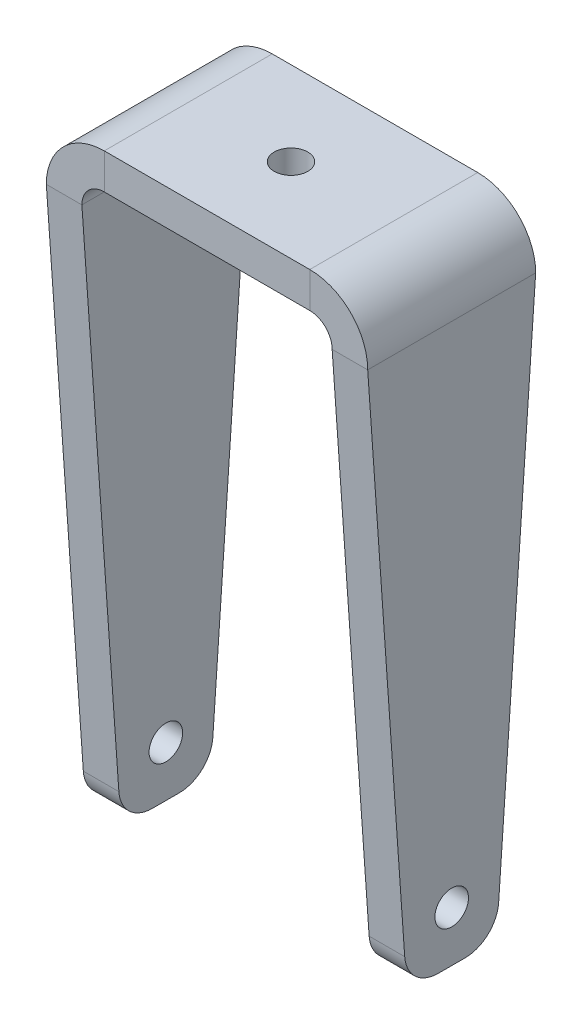
ISO-10303-21;
HEADER;
FILE_DESCRIPTION(('STEP AP214'),'2;1');
FILE_NAME('part.step','',(''),(''),'','','');
FILE_SCHEMA(('AUTOMOTIVE_DESIGN { 1 0 10303 214 1 1 1 1 }'));
ENDSEC;
DATA;
#1=APPLICATION_CONTEXT('core data for automotive mechanical design processes');
#2=APPLICATION_PROTOCOL_DEFINITION('international standard','automotive_design',2000,#1);
#3=PRODUCT_CONTEXT('',#1,'mechanical');
#4=PRODUCT('Part','Part','',(#3));
#5=PRODUCT_RELATED_PRODUCT_CATEGORY('part','',(#4));
#6=PRODUCT_DEFINITION_FORMATION('','',#4);
#7=PRODUCT_DEFINITION_CONTEXT('part definition',#1,'design');
#8=PRODUCT_DEFINITION('design','',#6,#7);
#9=PRODUCT_DEFINITION_SHAPE('','',#8);
#10=(LENGTH_UNIT() NAMED_UNIT(*) SI_UNIT(.MILLI.,.METRE.));
#11=(NAMED_UNIT(*) PLANE_ANGLE_UNIT() SI_UNIT($,.RADIAN.));
#12=(NAMED_UNIT(*) SI_UNIT($,.STERADIAN.) SOLID_ANGLE_UNIT());
#13=UNCERTAINTY_MEASURE_WITH_UNIT(LENGTH_MEASURE(1.E-05),#10,'distance_accuracy_value','');
#14=(GEOMETRIC_REPRESENTATION_CONTEXT(3) GLOBAL_UNCERTAINTY_ASSIGNED_CONTEXT((#13)) GLOBAL_UNIT_ASSIGNED_CONTEXT((#10,
#11,#12)) REPRESENTATION_CONTEXT('',''));
#15=CARTESIAN_POINT('',(0.,0.,0.));
#16=DIRECTION('',(0.,0.,1.));
#17=DIRECTION('',(1.,0.,0.));
#18=AXIS2_PLACEMENT_3D('',#15,#16,#17);
#19=CARTESIAN_POINT('',(0.,-3.175,0.));
#20=DIRECTION('',(0.,-1.,0.));
#21=DIRECTION('',(0.,0.,-1.));
#22=AXIS2_PLACEMENT_3D('',#19,#20,#21);
#23=PLANE('',#22);
#24=CARTESIAN_POINT('',(0.,-3.175,-7.50000000000008));
#25=DIRECTION('',(0.,-1.,0.));
#26=DIRECTION('',(0.,0.,-1.));
#27=AXIS2_PLACEMENT_3D('',#24,#25,#26);
#28=CIRCLE('',#27,1.50000000000001);
#29=CARTESIAN_POINT('',(0.,-3.175,-9.00000000000008));
#30=VERTEX_POINT('',#29);
#31=EDGE_CURVE('E233',#30,#30,#28,.T.);
#32=ORIENTED_EDGE('',*,*,#31,.F.);
#33=EDGE_LOOP('',(#32));
#34=FACE_BOUND('',#33,.T.);
#35=DIRECTION('',(1.,0.,0.));
#36=VECTOR('',#35,1.);
#37=CARTESIAN_POINT('',(-14.3500000000016,-3.175,0.));
#38=LINE('',#37,#36);
#39=CARTESIAN_POINT('',(-9.17500000000162,-3.175,0.));
#40=VERTEX_POINT('',#39);
#41=CARTESIAN_POINT('',(9.17500000000162,-3.175,0.));
#42=VERTEX_POINT('',#41);
#43=EDGE_CURVE('E284',#40,#42,#38,.T.);
#44=ORIENTED_EDGE('',*,*,#43,.F.);
#45=DIRECTION('',(0.,0.,-1.));
#46=VECTOR('',#45,1.);
#47=CARTESIAN_POINT('',(-9.17500000000162,-3.175,-15.));
#48=LINE('',#47,#46);
#49=CARTESIAN_POINT('',(-9.17500000000162,-3.175,-15.));
#50=VERTEX_POINT('',#49);
#51=EDGE_CURVE('E240',#50,#40,#48,.F.);
#52=ORIENTED_EDGE('',*,*,#51,.F.);
#53=DIRECTION('',(-1.,0.,0.));
#54=VECTOR('',#53,1.);
#55=CARTESIAN_POINT('',(-14.3500000000016,-3.175,-15.));
#56=LINE('',#55,#54);
#57=CARTESIAN_POINT('',(9.17500000000162,-3.175,-15.));
#58=VERTEX_POINT('',#57);
#59=EDGE_CURVE('E281',#58,#50,#56,.T.);
#60=ORIENTED_EDGE('',*,*,#59,.F.);
#61=DIRECTION('',(0.,0.,1.));
#62=VECTOR('',#61,1.);
#63=CARTESIAN_POINT('',(9.17500000000162,-3.175,0.));
#64=LINE('',#63,#62);
#65=EDGE_CURVE('E269',#42,#58,#64,.F.);
#66=ORIENTED_EDGE('',*,*,#65,.F.);
#67=EDGE_LOOP('',(#44,#52,#60,#66));
#68=FACE_BOUND('',#67,.T.);
#69=ADVANCED_FACE('F79',(#34,#68),#23,.T.);
#70=CARTESIAN_POINT('',(0.,0.,0.));
#71=DIRECTION('',(0.,-1.,0.));
#72=DIRECTION('',(0.,0.,-1.));
#73=AXIS2_PLACEMENT_3D('',#70,#71,#72);
#74=PLANE('',#73);
#75=CARTESIAN_POINT('',(0.,0.,-7.50000000000008));
#76=DIRECTION('',(0.,1.,0.));
#77=DIRECTION('',(0.,0.,1.));
#78=AXIS2_PLACEMENT_3D('',#75,#76,#77);
#79=CIRCLE('',#78,1.50000000000001);
#80=CARTESIAN_POINT('',(0.,0.,-6.00000000000007));
#81=VERTEX_POINT('',#80);
#82=EDGE_CURVE('E331',#81,#81,#79,.T.);
#83=ORIENTED_EDGE('',*,*,#82,.F.);
#84=EDGE_LOOP('',(#83));
#85=FACE_BOUND('',#84,.T.);
#86=DIRECTION('',(0.,0.,-1.));
#87=VECTOR('',#86,1.);
#88=CARTESIAN_POINT('',(-9.17500000000162,0.,-15.));
#89=LINE('',#88,#87);
#90=CARTESIAN_POINT('',(-9.17500000000162,0.,-15.));
#91=VERTEX_POINT('',#90);
#92=CARTESIAN_POINT('',(-9.17500000000162,0.,0.));
#93=VERTEX_POINT('',#92);
#94=EDGE_CURVE('E209',#91,#93,#89,.F.);
#95=ORIENTED_EDGE('',*,*,#94,.T.);
#96=DIRECTION('',(1.,0.,0.));
#97=VECTOR('',#96,1.);
#98=CARTESIAN_POINT('',(-14.3500000000016,0.,0.));
#99=LINE('',#98,#97);
#100=CARTESIAN_POINT('',(9.17500000000162,0.,0.));
#101=VERTEX_POINT('',#100);
#102=EDGE_CURVE('E285',#93,#101,#99,.T.);
#103=ORIENTED_EDGE('',*,*,#102,.T.);
#104=DIRECTION('',(0.,0.,1.));
#105=VECTOR('',#104,1.);
#106=CARTESIAN_POINT('',(9.17500000000162,0.,0.));
#107=LINE('',#106,#105);
#108=CARTESIAN_POINT('',(9.17500000000162,0.,-15.));
#109=VERTEX_POINT('',#108);
#110=EDGE_CURVE('E262',#101,#109,#107,.F.);
#111=ORIENTED_EDGE('',*,*,#110,.T.);
#112=DIRECTION('',(-1.,0.,0.));
#113=VECTOR('',#112,1.);
#114=CARTESIAN_POINT('',(-14.3500000000016,0.,-15.));
#115=LINE('',#114,#113);
#116=EDGE_CURVE('E277',#109,#91,#115,.T.);
#117=ORIENTED_EDGE('',*,*,#116,.T.);
#118=EDGE_LOOP('',(#95,#103,#111,#117));
#119=FACE_BOUND('',#118,.T.);
#120=ADVANCED_FACE('F421',(#85,#119),#74,.F.);
#121=CARTESIAN_POINT('',(-14.3500000000016,-3.175,-15.));
#122=DIRECTION('',(0.,0.,-1.));
#123=DIRECTION('',(-1.,0.,0.));
#124=AXIS2_PLACEMENT_3D('',#121,#122,#123);
#125=PLANE('',#124);
#126=ORIENTED_EDGE('',*,*,#59,.T.);
#127=DIRECTION('',(0.,1.,0.));
#128=VECTOR('',#127,1.);
#129=CARTESIAN_POINT('',(-9.17500000000162,-3.175,-15.));
#130=LINE('',#129,#128);
#131=EDGE_CURVE('E236',#50,#91,#130,.T.);
#132=ORIENTED_EDGE('',*,*,#131,.T.);
#133=ORIENTED_EDGE('',*,*,#116,.F.);
#134=DIRECTION('',(0.,1.,0.));
#135=VECTOR('',#134,1.);
#136=CARTESIAN_POINT('',(9.17500000000162,-3.175,-15.));
#137=LINE('',#136,#135);
#138=EDGE_CURVE('E274',#58,#109,#137,.T.);
#139=ORIENTED_EDGE('',*,*,#138,.F.);
#140=EDGE_LOOP('',(#126,#132,#133,#139));
#141=FACE_BOUND('',#140,.T.);
#142=ADVANCED_FACE('F406',(#141),#125,.T.);
#143=CARTESIAN_POINT('',(-14.3500000000016,-3.175,0.));
#144=DIRECTION('',(0.,0.,1.));
#145=DIRECTION('',(1.,0.,0.));
#146=AXIS2_PLACEMENT_3D('',#143,#144,#145);
#147=PLANE('',#146);
#148=DIRECTION('',(0.,1.,0.));
#149=VECTOR('',#148,1.);
#150=CARTESIAN_POINT('',(-9.17500000000162,-3.175,0.));
#151=LINE('',#150,#149);
#152=EDGE_CURVE('E244',#40,#93,#151,.T.);
#153=ORIENTED_EDGE('',*,*,#152,.F.);
#154=ORIENTED_EDGE('',*,*,#43,.T.);
#155=DIRECTION('',(0.,1.,0.));
#156=VECTOR('',#155,1.);
#157=CARTESIAN_POINT('',(9.17500000000162,-3.175,0.));
#158=LINE('',#157,#156);
#159=EDGE_CURVE('E278',#42,#101,#158,.T.);
#160=ORIENTED_EDGE('',*,*,#159,.T.);
#161=ORIENTED_EDGE('',*,*,#102,.F.);
#162=EDGE_LOOP('',(#153,#154,#160,#161));
#163=FACE_BOUND('',#162,.T.);
#164=ADVANCED_FACE('F419',(#163),#147,.T.);
#165=CARTESIAN_POINT('',(9.17500000000162,-5.175,-15.));
#166=DIRECTION('',(0.,0.,-1.));
#167=DIRECTION('',(-1.,0.,0.));
#168=AXIS2_PLACEMENT_3D('',#165,#166,#167);
#169=PLANE('',#168);
#170=DIRECTION('',(1.,0.,0.));
#171=VECTOR('',#170,1.);
#172=CARTESIAN_POINT('',(14.3500000000016,-5.17499999999998,-15.));
#173=LINE('',#172,#171);
#174=CARTESIAN_POINT('',(11.1750000000016,-5.17499999999999,-15.));
#175=VERTEX_POINT('',#174);
#176=CARTESIAN_POINT('',(14.3500000000016,-5.17499999999998,-15.));
#177=VERTEX_POINT('',#176);
#178=EDGE_CURVE('E247',#175,#177,#173,.T.);
#179=ORIENTED_EDGE('',*,*,#178,.F.);
#180=CARTESIAN_POINT('',(9.17500000000162,-5.175,-15.));
#181=DIRECTION('',(0.,0.,1.));
#182=DIRECTION('',(1.,0.,0.));
#183=AXIS2_PLACEMENT_3D('',#180,#181,#182);
#184=CIRCLE('',#183,2.);
#185=EDGE_CURVE('E266',#58,#175,#184,.F.);
#186=ORIENTED_EDGE('',*,*,#185,.F.);
#187=ORIENTED_EDGE('',*,*,#138,.T.);
#188=CARTESIAN_POINT('',(9.17500000000162,-5.175,-15.));
#189=DIRECTION('',(0.,0.,1.));
#190=DIRECTION('',(1.,0.,0.));
#191=AXIS2_PLACEMENT_3D('',#188,#189,#190);
#192=CIRCLE('',#191,5.175);
#193=EDGE_CURVE('E264',#109,#177,#192,.F.);
#194=ORIENTED_EDGE('',*,*,#193,.T.);
#195=EDGE_LOOP('',(#179,#186,#187,#194));
#196=FACE_BOUND('',#195,.T.);
#197=ADVANCED_FACE('F401',(#196),#169,.T.);
#198=CARTESIAN_POINT('',(9.17500000000162,-5.175,0.));
#199=DIRECTION('',(0.,0.,-1.));
#200=DIRECTION('',(-1.,0.,0.));
#201=AXIS2_PLACEMENT_3D('',#198,#199,#200);
#202=PLANE('',#201);
#203=CARTESIAN_POINT('',(9.17500000000162,-5.175,0.));
#204=DIRECTION('',(0.,0.,1.));
#205=DIRECTION('',(1.,0.,0.));
#206=AXIS2_PLACEMENT_3D('',#203,#204,#205);
#207=CIRCLE('',#206,2.);
#208=CARTESIAN_POINT('',(11.1750000000016,-5.17499999999999,0.));
#209=VERTEX_POINT('',#208);
#210=EDGE_CURVE('E253',#209,#42,#207,.T.);
#211=ORIENTED_EDGE('',*,*,#210,.F.);
#212=DIRECTION('',(1.,0.,0.));
#213=VECTOR('',#212,1.);
#214=CARTESIAN_POINT('',(11.1750000000016,-5.17499999999999,0.));
#215=LINE('',#214,#213);
#216=CARTESIAN_POINT('',(14.3500000000016,-5.17499999999998,0.));
#217=VERTEX_POINT('',#216);
#218=EDGE_CURVE('E261',#209,#217,#215,.T.);
#219=ORIENTED_EDGE('',*,*,#218,.T.);
#220=CARTESIAN_POINT('',(9.17500000000162,-5.175,0.));
#221=DIRECTION('',(0.,0.,1.));
#222=DIRECTION('',(1.,0.,0.));
#223=AXIS2_PLACEMENT_3D('',#220,#221,#222);
#224=CIRCLE('',#223,5.175);
#225=EDGE_CURVE('E265',#217,#101,#224,.T.);
#226=ORIENTED_EDGE('',*,*,#225,.T.);
#227=ORIENTED_EDGE('',*,*,#159,.F.);
#228=EDGE_LOOP('',(#211,#219,#226,#227));
#229=FACE_BOUND('',#228,.T.);
#230=ADVANCED_FACE('F416',(#229),#202,.F.);
#231=CARTESIAN_POINT('',(9.17500000000162,-5.175,0.));
#232=DIRECTION('',(0.,0.,1.));
#233=DIRECTION('',(1.,0.,0.));
#234=AXIS2_PLACEMENT_3D('',#231,#232,#233);
#235=CYLINDRICAL_SURFACE('',#234,5.175);
#236=ORIENTED_EDGE('',*,*,#110,.F.);
#237=ORIENTED_EDGE('',*,*,#225,.F.);
#238=DIRECTION('',(0.,0.,1.));
#239=VECTOR('',#238,1.);
#240=CARTESIAN_POINT('',(14.3500000000016,-5.17499999999998,0.));
#241=LINE('',#240,#239);
#242=EDGE_CURVE('E257',#177,#217,#241,.T.);
#243=ORIENTED_EDGE('',*,*,#242,.F.);
#244=ORIENTED_EDGE('',*,*,#193,.F.);
#245=EDGE_LOOP('',(#236,#237,#243,#244));
#246=FACE_BOUND('',#245,.T.);
#247=ADVANCED_FACE('F398',(#246),#235,.T.);
#248=CARTESIAN_POINT('',(9.17500000000162,-5.175,0.));
#249=DIRECTION('',(0.,0.,1.));
#250=DIRECTION('',(1.,0.,0.));
#251=AXIS2_PLACEMENT_3D('',#248,#249,#250);
#252=CYLINDRICAL_SURFACE('',#251,2.);
#253=ORIENTED_EDGE('',*,*,#65,.T.);
#254=ORIENTED_EDGE('',*,*,#185,.T.);
#255=DIRECTION('',(0.,0.,-1.));
#256=VECTOR('',#255,1.);
#257=CARTESIAN_POINT('',(11.1750000000016,-5.17499999999999,-15.0000000000001));
#258=LINE('',#257,#256);
#259=EDGE_CURVE('E258',#175,#209,#258,.F.);
#260=ORIENTED_EDGE('',*,*,#259,.T.);
#261=ORIENTED_EDGE('',*,*,#210,.T.);
#262=EDGE_LOOP('',(#253,#254,#260,#261));
#263=FACE_BOUND('',#262,.T.);
#264=ADVANCED_FACE('F412',(#263),#252,.F.);
#265=CARTESIAN_POINT('',(14.3500000000016,0.,0.));
#266=DIRECTION('',(1.,0.,0.));
#267=DIRECTION('',(0.,1.,0.));
#268=AXIS2_PLACEMENT_3D('',#265,#266,#267);
#269=PLANE('',#268);
#270=CARTESIAN_POINT('',(14.3500000000018,-50.5,-7.5));
#271=DIRECTION('',(1.,0.,0.));
#272=DIRECTION('',(0.,1.,0.));
#273=AXIS2_PLACEMENT_3D('',#270,#271,#272);
#274=CIRCLE('',#273,1.5);
#275=CARTESIAN_POINT('',(14.3500000000018,-49.,-7.5));
#276=VERTEX_POINT('',#275);
#277=EDGE_CURVE('E362',#276,#276,#274,.T.);
#278=ORIENTED_EDGE('',*,*,#277,.F.);
#279=EDGE_LOOP('',(#278));
#280=FACE_BOUND('',#279,.T.);
#281=DIRECTION('',(0.,0.997541853068174,0.0700731858653007));
#282=VECTOR('',#281,1.);
#283=CARTESIAN_POINT('',(14.3500000000016,-0.0254105508775338,0.361737342136047));
#284=LINE('',#283,#282);
#285=CARTESIAN_POINT('',(14.3500000000018,-52.2102195575959,-3.30402947218436));
#286=VERTEX_POINT('',#285);
#287=EDGE_CURVE('E314',#286,#217,#284,.T.);
#288=ORIENTED_EDGE('',*,*,#287,.F.);
#289=CARTESIAN_POINT('',(14.3500000000018,-52.,-6.29665503138888));
#290=DIRECTION('',(1.,0.,0.));
#291=DIRECTION('',(0.,1.,0.));
#292=AXIS2_PLACEMENT_3D('',#289,#290,#291);
#293=CIRCLE('',#292,3.);
#294=CARTESIAN_POINT('',(14.3500000000018,-55.,-6.29665503138888));
#295=VERTEX_POINT('',#294);
#296=EDGE_CURVE('E378',#286,#295,#293,.T.);
#297=ORIENTED_EDGE('',*,*,#296,.T.);
#298=DIRECTION('',(0.,0.,1.));
#299=VECTOR('',#298,1.);
#300=CARTESIAN_POINT('',(14.3500000000018,-55.,0.));
#301=LINE('',#300,#299);
#302=CARTESIAN_POINT('',(14.3500000000018,-55.,-8.70334496861112));
#303=VERTEX_POINT('',#302);
#304=EDGE_CURVE('E250',#303,#295,#301,.T.);
#305=ORIENTED_EDGE('',*,*,#304,.F.);
#306=CARTESIAN_POINT('',(14.3500000000018,-52.,-8.70334496861112));
#307=DIRECTION('',(1.,0.,0.));
#308=DIRECTION('',(0.,1.,0.));
#309=AXIS2_PLACEMENT_3D('',#306,#307,#308);
#310=CIRCLE('',#309,3.);
#311=CARTESIAN_POINT('',(14.3500000000018,-52.2102195575959,-11.6959705278156));
#312=VERTEX_POINT('',#311);
#313=EDGE_CURVE('E379',#303,#312,#310,.T.);
#314=ORIENTED_EDGE('',*,*,#313,.T.);
#315=DIRECTION('',(0.,-0.997541853068174,0.0700731858653007));
#316=VECTOR('',#315,1.);
#317=CARTESIAN_POINT('',(14.3500000000016,-1.07392458605447,-15.2880835714764));
#318=LINE('',#317,#316);
#319=EDGE_CURVE('E328',#177,#312,#318,.T.);
#320=ORIENTED_EDGE('',*,*,#319,.F.);
#321=ORIENTED_EDGE('',*,*,#242,.T.);
#322=EDGE_LOOP('',(#288,#297,#305,#314,#320,#321));
#323=FACE_BOUND('',#322,.T.);
#324=ADVANCED_FACE('F393',(#280,#323),#269,.T.);
#325=CARTESIAN_POINT('',(11.1750000000016,0.,0.));
#326=DIRECTION('',(1.,0.,0.));
#327=DIRECTION('',(0.,1.,0.));
#328=AXIS2_PLACEMENT_3D('',#325,#326,#327);
#329=PLANE('',#328);
#330=CARTESIAN_POINT('',(11.1750000000018,-50.5,-7.5));
#331=DIRECTION('',(1.,0.,0.));
#332=DIRECTION('',(0.,1.,0.));
#333=AXIS2_PLACEMENT_3D('',#330,#331,#332);
#334=CIRCLE('',#333,1.5);
#335=CARTESIAN_POINT('',(11.1750000000018,-49.,-7.5));
#336=VERTEX_POINT('',#335);
#337=EDGE_CURVE('E312',#336,#336,#334,.T.);
#338=ORIENTED_EDGE('',*,*,#337,.T.);
#339=EDGE_LOOP('',(#338));
#340=FACE_BOUND('',#339,.T.);
#341=DIRECTION('',(0.,0.,-1.));
#342=VECTOR('',#341,1.);
#343=CARTESIAN_POINT('',(11.1750000000018,-55.,0.));
#344=LINE('',#343,#342);
#345=CARTESIAN_POINT('',(11.1750000000018,-55.,-8.70334496861112));
#346=VERTEX_POINT('',#345);
#347=CARTESIAN_POINT('',(11.1750000000018,-55.,-6.29665503138888));
#348=VERTEX_POINT('',#347);
#349=EDGE_CURVE('E254',#346,#348,#344,.F.);
#350=ORIENTED_EDGE('',*,*,#349,.T.);
#351=CARTESIAN_POINT('',(11.1750000000018,-52.,-6.29665503138888));
#352=DIRECTION('',(1.,0.,0.));
#353=DIRECTION('',(0.,1.,0.));
#354=AXIS2_PLACEMENT_3D('',#351,#352,#353);
#355=CIRCLE('',#354,3.);
#356=CARTESIAN_POINT('',(11.1750000000018,-52.2102195575959,-3.30402947218436));
#357=VERTEX_POINT('',#356);
#358=EDGE_CURVE('E367',#348,#357,#355,.F.);
#359=ORIENTED_EDGE('',*,*,#358,.T.);
#360=DIRECTION('',(0.,0.997541853068174,0.0700731858653007));
#361=VECTOR('',#360,1.);
#362=CARTESIAN_POINT('',(11.1750000000016,-0.0254105508775449,0.361737342136047));
#363=LINE('',#362,#361);
#364=EDGE_CURVE('E318',#357,#209,#363,.T.);
#365=ORIENTED_EDGE('',*,*,#364,.T.);
#366=ORIENTED_EDGE('',*,*,#259,.F.);
#367=DIRECTION('',(0.,-0.997541853068174,0.0700731858653007));
#368=VECTOR('',#367,1.);
#369=CARTESIAN_POINT('',(11.1750000000016,-1.07392458605449,-15.2880835714764));
#370=LINE('',#369,#368);
#371=CARTESIAN_POINT('',(11.1750000000018,-52.2102195575959,-11.6959705278156));
#372=VERTEX_POINT('',#371);
#373=EDGE_CURVE('E325',#175,#372,#370,.T.);
#374=ORIENTED_EDGE('',*,*,#373,.T.);
#375=CARTESIAN_POINT('',(11.1750000000018,-52.,-8.70334496861112));
#376=DIRECTION('',(1.,0.,0.));
#377=DIRECTION('',(0.,1.,0.));
#378=AXIS2_PLACEMENT_3D('',#375,#376,#377);
#379=CIRCLE('',#378,3.);
#380=EDGE_CURVE('E371',#372,#346,#379,.F.);
#381=ORIENTED_EDGE('',*,*,#380,.T.);
#382=EDGE_LOOP('',(#350,#359,#365,#366,#374,#381));
#383=FACE_BOUND('',#382,.T.);
#384=ADVANCED_FACE('F570',(#340,#383),#329,.F.);
#385=CARTESIAN_POINT('',(14.3500000000018,-55.,0.));
#386=DIRECTION('',(0.,-1.,0.));
#387=DIRECTION('',(1.,0.,0.));
#388=AXIS2_PLACEMENT_3D('',#385,#386,#387);
#389=PLANE('',#388);
#390=ORIENTED_EDGE('',*,*,#304,.T.);
#391=DIRECTION('',(1.,0.,0.));
#392=VECTOR('',#391,1.);
#393=CARTESIAN_POINT('',(11.1750000000018,-55.,-6.29665503138888));
#394=LINE('',#393,#392);
#395=EDGE_CURVE('E373',#295,#348,#394,.F.);
#396=ORIENTED_EDGE('',*,*,#395,.T.);
#397=ORIENTED_EDGE('',*,*,#349,.F.);
#398=DIRECTION('',(1.,0.,0.));
#399=VECTOR('',#398,1.);
#400=CARTESIAN_POINT('',(14.3500000000018,-55.,-8.70334496861112));
#401=LINE('',#400,#399);
#402=EDGE_CURVE('E375',#346,#303,#401,.T.);
#403=ORIENTED_EDGE('',*,*,#402,.T.);
#404=EDGE_LOOP('',(#390,#396,#397,#403));
#405=FACE_BOUND('',#404,.T.);
#406=ADVANCED_FACE('F564',(#405),#389,.T.);
#407=CARTESIAN_POINT('',(-9.17500000000162,-5.175,0.));
#408=DIRECTION('',(0.,0.,1.));
#409=DIRECTION('',(1.,0.,0.));
#410=AXIS2_PLACEMENT_3D('',#407,#408,#409);
#411=PLANE('',#410);
#412=DIRECTION('',(-1.,0.,0.));
#413=VECTOR('',#412,1.);
#414=CARTESIAN_POINT('',(-14.3500000000016,-5.17499999999998,0.));
#415=LINE('',#414,#413);
#416=CARTESIAN_POINT('',(-11.1750000000016,-5.17500000000007,0.));
#417=VERTEX_POINT('',#416);
#418=CARTESIAN_POINT('',(-14.350000000002,-5.17500000000008,0.));
#419=VERTEX_POINT('',#418);
#420=EDGE_CURVE('E231',#417,#419,#415,.T.);
#421=ORIENTED_EDGE('',*,*,#420,.F.);
#422=CARTESIAN_POINT('',(-9.17500000000162,-5.175,0.));
#423=DIRECTION('',(0.,0.,-1.));
#424=DIRECTION('',(-1.,0.,0.));
#425=AXIS2_PLACEMENT_3D('',#422,#423,#424);
#426=CIRCLE('',#425,2.);
#427=EDGE_CURVE('E212',#40,#417,#426,.F.);
#428=ORIENTED_EDGE('',*,*,#427,.F.);
#429=ORIENTED_EDGE('',*,*,#152,.T.);
#430=CARTESIAN_POINT('',(-9.17500000000162,-5.175,0.));
#431=DIRECTION('',(0.,0.,-1.));
#432=DIRECTION('',(-1.,0.,0.));
#433=AXIS2_PLACEMENT_3D('',#430,#431,#432);
#434=CIRCLE('',#433,5.175);
#435=EDGE_CURVE('E235',#93,#419,#434,.F.);
#436=ORIENTED_EDGE('',*,*,#435,.T.);
#437=EDGE_LOOP('',(#421,#428,#429,#436));
#438=FACE_BOUND('',#437,.T.);
#439=ADVANCED_FACE('F569',(#438),#411,.T.);
#440=CARTESIAN_POINT('',(-9.17500000000162,-5.175,-15.));
#441=DIRECTION('',(0.,0.,1.));
#442=DIRECTION('',(1.,0.,0.));
#443=AXIS2_PLACEMENT_3D('',#440,#441,#442);
#444=PLANE('',#443);
#445=CARTESIAN_POINT('',(-9.17500000000162,-5.175,-15.));
#446=DIRECTION('',(0.,0.,-1.));
#447=DIRECTION('',(-1.,0.,0.));
#448=AXIS2_PLACEMENT_3D('',#445,#446,#447);
#449=CIRCLE('',#448,2.);
#450=CARTESIAN_POINT('',(-11.1750000000016,-5.17500000000007,-15.));
#451=VERTEX_POINT('',#450);
#452=EDGE_CURVE('E217',#451,#50,#449,.T.);
#453=ORIENTED_EDGE('',*,*,#452,.F.);
#454=DIRECTION('',(-1.,0.,0.));
#455=VECTOR('',#454,1.);
#456=CARTESIAN_POINT('',(-11.1750000000016,-5.17499999999999,-15.));
#457=LINE('',#456,#455);
#458=CARTESIAN_POINT('',(-14.350000000002,-5.17500000000008,-15.));
#459=VERTEX_POINT('',#458);
#460=EDGE_CURVE('E194',#451,#459,#457,.T.);
#461=ORIENTED_EDGE('',*,*,#460,.T.);
#462=CARTESIAN_POINT('',(-9.17500000000162,-5.175,-15.));
#463=DIRECTION('',(0.,0.,-1.));
#464=DIRECTION('',(-1.,0.,0.));
#465=AXIS2_PLACEMENT_3D('',#462,#463,#464);
#466=CIRCLE('',#465,5.175);
#467=EDGE_CURVE('E204',#459,#91,#466,.T.);
#468=ORIENTED_EDGE('',*,*,#467,.T.);
#469=ORIENTED_EDGE('',*,*,#131,.F.);
#470=EDGE_LOOP('',(#453,#461,#468,#469));
#471=FACE_BOUND('',#470,.T.);
#472=ADVANCED_FACE('F215',(#471),#444,.F.);
#473=CARTESIAN_POINT('',(-9.17500000000162,-5.175,-15.));
#474=DIRECTION('',(0.,0.,-1.));
#475=DIRECTION('',(-1.,0.,0.));
#476=AXIS2_PLACEMENT_3D('',#473,#474,#475);
#477=CYLINDRICAL_SURFACE('',#476,5.175);
#478=ORIENTED_EDGE('',*,*,#94,.F.);
#479=ORIENTED_EDGE('',*,*,#467,.F.);
#480=DIRECTION('',(0.,0.,-1.));
#481=VECTOR('',#480,1.);
#482=CARTESIAN_POINT('',(-14.3500000000016,-5.17499999999998,0.));
#483=LINE('',#482,#481);
#484=EDGE_CURVE('E207',#419,#459,#483,.T.);
#485=ORIENTED_EDGE('',*,*,#484,.F.);
#486=ORIENTED_EDGE('',*,*,#435,.F.);
#487=EDGE_LOOP('',(#478,#479,#485,#486));
#488=FACE_BOUND('',#487,.T.);
#489=ADVANCED_FACE('F205',(#488),#477,.T.);
#490=CARTESIAN_POINT('',(-9.17500000000162,-5.175,-15.));
#491=DIRECTION('',(0.,0.,-1.));
#492=DIRECTION('',(-1.,0.,0.));
#493=AXIS2_PLACEMENT_3D('',#490,#491,#492);
#494=CYLINDRICAL_SURFACE('',#493,2.);
#495=ORIENTED_EDGE('',*,*,#51,.T.);
#496=ORIENTED_EDGE('',*,*,#427,.T.);
#497=DIRECTION('',(0.,0.,1.));
#498=VECTOR('',#497,1.);
#499=CARTESIAN_POINT('',(-11.1750000000016,-5.17499999999999,0.));
#500=LINE('',#499,#498);
#501=EDGE_CURVE('E218',#417,#451,#500,.F.);
#502=ORIENTED_EDGE('',*,*,#501,.T.);
#503=ORIENTED_EDGE('',*,*,#452,.T.);
#504=EDGE_LOOP('',(#495,#496,#502,#503));
#505=FACE_BOUND('',#504,.T.);
#506=ADVANCED_FACE('F423',(#505),#494,.F.);
#507=CARTESIAN_POINT('',(-14.3500000000016,0.,0.));
#508=DIRECTION('',(-1.,0.,0.));
#509=DIRECTION('',(0.,-1.,0.));
#510=AXIS2_PLACEMENT_3D('',#507,#508,#509);
#511=PLANE('',#510);
#512=CARTESIAN_POINT('',(-14.350000000002,-50.5000000000001,-7.5));
#513=DIRECTION('',(1.,0.,0.));
#514=DIRECTION('',(0.,1.,0.));
#515=AXIS2_PLACEMENT_3D('',#512,#513,#514);
#516=CIRCLE('',#515,1.5);
#517=CARTESIAN_POINT('',(-14.350000000002,-49.0000000000001,-7.5));
#518=VERTEX_POINT('',#517);
#519=EDGE_CURVE('E313',#518,#518,#516,.T.);
#520=ORIENTED_EDGE('',*,*,#519,.T.);
#521=EDGE_LOOP('',(#520));
#522=FACE_BOUND('',#521,.T.);
#523=DIRECTION('',(0.,0.,-1.));
#524=VECTOR('',#523,1.);
#525=CARTESIAN_POINT('',(-14.3500000000018,-54.9999999999999,-15.0000000000002));
#526=LINE('',#525,#524);
#527=CARTESIAN_POINT('',(-14.3500000000018,-54.9999999999999,-6.29665503138887));
#528=VERTEX_POINT('',#527);
#529=CARTESIAN_POINT('',(-14.3500000000018,-54.9999999999999,-8.70334496861113));
#530=VERTEX_POINT('',#529);
#531=EDGE_CURVE('E226',#528,#530,#526,.T.);
#532=ORIENTED_EDGE('',*,*,#531,.F.);
#533=CARTESIAN_POINT('',(-14.3500000000018,-51.9999999999999,-6.29665503138887));
#534=DIRECTION('',(-1.,0.,0.));
#535=DIRECTION('',(0.,-1.,0.));
#536=AXIS2_PLACEMENT_3D('',#533,#534,#535);
#537=CIRCLE('',#536,3.);
#538=CARTESIAN_POINT('',(-14.3500000000018,-52.2102195575958,-3.30402947218435));
#539=VERTEX_POINT('',#538);
#540=EDGE_CURVE('E87',#528,#539,#537,.T.);
#541=ORIENTED_EDGE('',*,*,#540,.T.);
#542=DIRECTION('',(0.,0.997541853068174,0.0700731858653007));
#543=VECTOR('',#542,1.);
#544=CARTESIAN_POINT('',(-14.3500000000018,-55.0000000000001,-3.5));
#545=LINE('',#544,#543);
#546=EDGE_CURVE('E198',#539,#419,#545,.T.);
#547=ORIENTED_EDGE('',*,*,#546,.T.);
#548=ORIENTED_EDGE('',*,*,#484,.T.);
#549=DIRECTION('',(0.,-0.997541853068174,0.0700731858653007));
#550=VECTOR('',#549,1.);
#551=CARTESIAN_POINT('',(-14.3500000000018,-55.0000000000001,-11.5));
#552=LINE('',#551,#550);
#553=CARTESIAN_POINT('',(-14.3500000000018,-52.2102195575958,-11.6959705278157));
#554=VERTEX_POINT('',#553);
#555=EDGE_CURVE('E190',#459,#554,#552,.T.);
#556=ORIENTED_EDGE('',*,*,#555,.T.);
#557=CARTESIAN_POINT('',(-14.3500000000018,-51.9999999999999,-8.70334496861113));
#558=DIRECTION('',(-1.,0.,0.));
#559=DIRECTION('',(0.,-1.,0.));
#560=AXIS2_PLACEMENT_3D('',#557,#558,#559);
#561=CIRCLE('',#560,3.);
#562=EDGE_CURVE('E99',#554,#530,#561,.T.);
#563=ORIENTED_EDGE('',*,*,#562,.T.);
#564=EDGE_LOOP('',(#532,#541,#547,#548,#556,#563));
#565=FACE_BOUND('',#564,.T.);
#566=ADVANCED_FACE('F220',(#522,#565),#511,.T.);
#567=CARTESIAN_POINT('',(-11.1750000000016,0.,0.));
#568=DIRECTION('',(-1.,0.,0.));
#569=DIRECTION('',(0.,-1.,0.));
#570=AXIS2_PLACEMENT_3D('',#567,#568,#569);
#571=PLANE('',#570);
#572=CARTESIAN_POINT('',(-11.1750000000018,-50.5000000000001,-7.5));
#573=DIRECTION('',(-1.,0.,0.));
#574=DIRECTION('',(0.,-1.,0.));
#575=AXIS2_PLACEMENT_3D('',#572,#573,#574);
#576=CIRCLE('',#575,1.5);
#577=CARTESIAN_POINT('',(-11.1750000000018,-52.0000000000001,-7.5));
#578=VERTEX_POINT('',#577);
#579=EDGE_CURVE('E309',#578,#578,#576,.T.);
#580=ORIENTED_EDGE('',*,*,#579,.T.);
#581=EDGE_LOOP('',(#580));
#582=FACE_BOUND('',#581,.T.);
#583=DIRECTION('',(0.,-0.997541853068174,-0.0700731858653007));
#584=VECTOR('',#583,1.);
#585=CARTESIAN_POINT('',(-11.1750000000016,-0.0254105508775452,0.361737342136052));
#586=LINE('',#585,#584);
#587=CARTESIAN_POINT('',(-11.1750000000018,-52.2102195575958,-3.30402947218435));
#588=VERTEX_POINT('',#587);
#589=EDGE_CURVE('E197',#417,#588,#586,.T.);
#590=ORIENTED_EDGE('',*,*,#589,.T.);
#591=CARTESIAN_POINT('',(-11.1750000000018,-51.9999999999999,-6.29665503138887));
#592=DIRECTION('',(-1.,0.,0.));
#593=DIRECTION('',(0.,-1.,0.));
#594=AXIS2_PLACEMENT_3D('',#591,#592,#593);
#595=CIRCLE('',#594,3.);
#596=CARTESIAN_POINT('',(-11.1750000000018,-54.9999999999999,-6.29665503138887));
#597=VERTEX_POINT('',#596);
#598=EDGE_CURVE('E348',#588,#597,#595,.F.);
#599=ORIENTED_EDGE('',*,*,#598,.T.);
#600=DIRECTION('',(0.,0.,1.));
#601=VECTOR('',#600,1.);
#602=CARTESIAN_POINT('',(-11.1750000000018,-54.9999999999999,0.));
#603=LINE('',#602,#601);
#604=CARTESIAN_POINT('',(-11.1750000000018,-54.9999999999999,-8.70334496861113));
#605=VERTEX_POINT('',#604);
#606=EDGE_CURVE('E223',#597,#605,#603,.F.);
#607=ORIENTED_EDGE('',*,*,#606,.T.);
#608=CARTESIAN_POINT('',(-11.1750000000018,-51.9999999999999,-8.70334496861113));
#609=DIRECTION('',(-1.,0.,0.));
#610=DIRECTION('',(0.,-1.,0.));
#611=AXIS2_PLACEMENT_3D('',#608,#609,#610);
#612=CIRCLE('',#611,3.);
#613=CARTESIAN_POINT('',(-11.1750000000018,-52.2102195575958,-11.6959705278157));
#614=VERTEX_POINT('',#613);
#615=EDGE_CURVE('E347',#605,#614,#612,.F.);
#616=ORIENTED_EDGE('',*,*,#615,.T.);
#617=DIRECTION('',(0.,0.997541853068174,-0.0700731858653007));
#618=VECTOR('',#617,1.);
#619=CARTESIAN_POINT('',(-11.1750000000016,-1.07392458605449,-15.2880835714764));
#620=LINE('',#619,#618);
#621=EDGE_CURVE('E317',#614,#451,#620,.T.);
#622=ORIENTED_EDGE('',*,*,#621,.T.);
#623=ORIENTED_EDGE('',*,*,#501,.F.);
#624=EDGE_LOOP('',(#590,#599,#607,#616,#622,#623));
#625=FACE_BOUND('',#624,.T.);
#626=ADVANCED_FACE('F427',(#582,#625),#571,.F.);
#627=CARTESIAN_POINT('',(-14.3500000000018,-54.9999999999999,-15.0000000000002));
#628=DIRECTION('',(0.,-1.,0.));
#629=DIRECTION('',(1.,0.,0.));
#630=AXIS2_PLACEMENT_3D('',#627,#628,#629);
#631=PLANE('',#630);
#632=ORIENTED_EDGE('',*,*,#606,.F.);
#633=DIRECTION('',(1.,0.,0.));
#634=VECTOR('',#633,1.);
#635=CARTESIAN_POINT('',(-14.3500000000018,-54.9999999999999,-6.29665503138887));
#636=LINE('',#635,#634);
#637=EDGE_CURVE('E344',#597,#528,#636,.F.);
#638=ORIENTED_EDGE('',*,*,#637,.T.);
#639=ORIENTED_EDGE('',*,*,#531,.T.);
#640=DIRECTION('',(1.,0.,0.));
#641=VECTOR('',#640,1.);
#642=CARTESIAN_POINT('',(-11.1750000000018,-54.9999999999999,-8.70334496861113));
#643=LINE('',#642,#641);
#644=EDGE_CURVE('E342',#530,#605,#643,.T.);
#645=ORIENTED_EDGE('',*,*,#644,.T.);
#646=EDGE_LOOP('',(#632,#638,#639,#645));
#647=FACE_BOUND('',#646,.T.);
#648=ADVANCED_FACE('F341',(#647),#631,.T.);
#649=CARTESIAN_POINT('',(0.,-10.,-7.50000000000008));
#650=DIRECTION('',(0.,1.,0.));
#651=DIRECTION('',(0.,0.,1.));
#652=AXIS2_PLACEMENT_3D('',#649,#650,#651);
#653=CYLINDRICAL_SURFACE('',#652,1.50000000000001);
#654=ORIENTED_EDGE('',*,*,#31,.T.);
#655=EDGE_LOOP('',(#654));
#656=FACE_BOUND('',#655,.T.);
#657=ORIENTED_EDGE('',*,*,#82,.T.);
#658=EDGE_LOOP('',(#657));
#659=FACE_BOUND('',#658,.T.);
#660=ADVANCED_FACE('F451',(#656,#659),#653,.F.);
#661=CARTESIAN_POINT('',(-14.3500000000018,-55.0000000000001,-3.5));
#662=DIRECTION('',(0.,0.0700731858653007,-0.997541853068174));
#663=DIRECTION('',(0.,0.997541853068174,0.0700731858653007));
#664=AXIS2_PLACEMENT_3D('',#661,#662,#663);
#665=PLANE('',#664);
#666=ORIENTED_EDGE('',*,*,#546,.F.);
#667=DIRECTION('',(1.,0.,0.));
#668=VECTOR('',#667,1.);
#669=CARTESIAN_POINT('',(-11.1750000000018,-52.2102195575958,-3.30402947218435));
#670=LINE('',#669,#668);
#671=EDGE_CURVE('E359',#539,#588,#670,.T.);
#672=ORIENTED_EDGE('',*,*,#671,.T.);
#673=ORIENTED_EDGE('',*,*,#589,.F.);
#674=ORIENTED_EDGE('',*,*,#420,.T.);
#675=EDGE_LOOP('',(#666,#672,#673,#674));
#676=FACE_BOUND('',#675,.T.);
#677=ADVANCED_FACE('F358',(#676),#665,.F.);
#678=CARTESIAN_POINT('',(-14.3500000000018,-55.0000000000001,-11.5));
#679=DIRECTION('',(0.,0.0700731858653007,0.997541853068174));
#680=DIRECTION('',(0.,-0.997541853068174,0.0700731858653007));
#681=AXIS2_PLACEMENT_3D('',#678,#679,#680);
#682=PLANE('',#681);
#683=ORIENTED_EDGE('',*,*,#621,.F.);
#684=DIRECTION('',(1.,0.,0.));
#685=VECTOR('',#684,1.);
#686=CARTESIAN_POINT('',(-14.3500000000018,-52.2102195575958,-11.6959705278157));
#687=LINE('',#686,#685);
#688=EDGE_CURVE('E13',#614,#554,#687,.F.);
#689=ORIENTED_EDGE('',*,*,#688,.T.);
#690=ORIENTED_EDGE('',*,*,#555,.F.);
#691=ORIENTED_EDGE('',*,*,#460,.F.);
#692=EDGE_LOOP('',(#683,#689,#690,#691));
#693=FACE_BOUND('',#692,.T.);
#694=ADVANCED_FACE('F192',(#693),#682,.F.);
#695=ORIENTED_EDGE('',*,*,#364,.F.);
#696=DIRECTION('',(1.,0.,0.));
#697=VECTOR('',#696,1.);
#698=CARTESIAN_POINT('',(14.3500000000018,-52.2102195575959,-3.30402947218436));
#699=LINE('',#698,#697);
#700=EDGE_CURVE('E287',#357,#286,#699,.T.);
#701=ORIENTED_EDGE('',*,*,#700,.T.);
#702=ORIENTED_EDGE('',*,*,#287,.T.);
#703=ORIENTED_EDGE('',*,*,#218,.F.);
#704=EDGE_LOOP('',(#695,#701,#702,#703));
#705=FACE_BOUND('',#704,.T.);
#706=ADVANCED_FACE('F388',(#705),#665,.F.);
#707=ORIENTED_EDGE('',*,*,#319,.T.);
#708=DIRECTION('',(1.,0.,0.));
#709=VECTOR('',#708,1.);
#710=CARTESIAN_POINT('',(11.1750000000018,-52.2102195575959,-11.6959705278156));
#711=LINE('',#710,#709);
#712=EDGE_CURVE('E365',#312,#372,#711,.F.);
#713=ORIENTED_EDGE('',*,*,#712,.T.);
#714=ORIENTED_EDGE('',*,*,#373,.F.);
#715=ORIENTED_EDGE('',*,*,#178,.T.);
#716=EDGE_LOOP('',(#707,#713,#714,#715));
#717=FACE_BOUND('',#716,.T.);
#718=ADVANCED_FACE('F441',(#717),#682,.F.);
#719=CARTESIAN_POINT('',(-14.350000000002,-50.5000000000001,-7.5));
#720=DIRECTION('',(1.,0.,0.));
#721=DIRECTION('',(0.,1.,0.));
#722=AXIS2_PLACEMENT_3D('',#719,#720,#721);
#723=CYLINDRICAL_SURFACE('',#722,1.5);
#724=ORIENTED_EDGE('',*,*,#519,.F.);
#725=EDGE_LOOP('',(#724));
#726=FACE_BOUND('',#725,.T.);
#727=ORIENTED_EDGE('',*,*,#579,.F.);
#728=EDGE_LOOP('',(#727));
#729=FACE_BOUND('',#728,.T.);
#730=ADVANCED_FACE('F437',(#726,#729),#723,.F.);
#731=ORIENTED_EDGE('',*,*,#277,.T.);
#732=EDGE_LOOP('',(#731));
#733=FACE_BOUND('',#732,.T.);
#734=ORIENTED_EDGE('',*,*,#337,.F.);
#735=EDGE_LOOP('',(#734));
#736=FACE_BOUND('',#735,.T.);
#737=ADVANCED_FACE('F440',(#733,#736),#723,.F.);
#738=CARTESIAN_POINT('',(-14.3500000000018,-52.0000000000001,-6.29665503138888));
#739=DIRECTION('',(-1.,0.,0.));
#740=DIRECTION('',(0.,-1.,0.));
#741=AXIS2_PLACEMENT_3D('',#738,#739,#740);
#742=CYLINDRICAL_SURFACE('',#741,3.);
#743=ORIENTED_EDGE('',*,*,#358,.F.);
#744=ORIENTED_EDGE('',*,*,#395,.F.);
#745=ORIENTED_EDGE('',*,*,#296,.F.);
#746=ORIENTED_EDGE('',*,*,#700,.F.);
#747=EDGE_LOOP('',(#743,#744,#745,#746));
#748=FACE_BOUND('',#747,.T.);
#749=ADVANCED_FACE('F470',(#748),#742,.T.);
#750=CARTESIAN_POINT('',(14.3500000000018,-52.,-8.70334496861112));
#751=DIRECTION('',(-1.,0.,0.));
#752=DIRECTION('',(0.,-1.,0.));
#753=AXIS2_PLACEMENT_3D('',#750,#751,#752);
#754=CYLINDRICAL_SURFACE('',#753,3.);
#755=ORIENTED_EDGE('',*,*,#380,.F.);
#756=ORIENTED_EDGE('',*,*,#712,.F.);
#757=ORIENTED_EDGE('',*,*,#313,.F.);
#758=ORIENTED_EDGE('',*,*,#402,.F.);
#759=EDGE_LOOP('',(#755,#756,#757,#758));
#760=FACE_BOUND('',#759,.T.);
#761=ADVANCED_FACE('F473',(#760),#754,.T.);
#762=CARTESIAN_POINT('',(-14.3500000000018,-51.9999999999999,-6.29665503138887));
#763=DIRECTION('',(-1.,0.,0.));
#764=DIRECTION('',(0.,-1.,0.));
#765=AXIS2_PLACEMENT_3D('',#762,#763,#764);
#766=CYLINDRICAL_SURFACE('',#765,3.);
#767=ORIENTED_EDGE('',*,*,#540,.F.);
#768=ORIENTED_EDGE('',*,*,#637,.F.);
#769=ORIENTED_EDGE('',*,*,#598,.F.);
#770=ORIENTED_EDGE('',*,*,#671,.F.);
#771=EDGE_LOOP('',(#767,#768,#769,#770));
#772=FACE_BOUND('',#771,.T.);
#773=ADVANCED_FACE('F364',(#772),#766,.T.);
#774=CARTESIAN_POINT('',(-14.3500000000018,-51.9999999999999,-8.70334496861113));
#775=DIRECTION('',(-1.,0.,0.));
#776=DIRECTION('',(0.,-1.,0.));
#777=AXIS2_PLACEMENT_3D('',#774,#775,#776);
#778=CYLINDRICAL_SURFACE('',#777,3.);
#779=ORIENTED_EDGE('',*,*,#562,.F.);
#780=ORIENTED_EDGE('',*,*,#688,.F.);
#781=ORIENTED_EDGE('',*,*,#615,.F.);
#782=ORIENTED_EDGE('',*,*,#644,.F.);
#783=EDGE_LOOP('',(#779,#780,#781,#782));
#784=FACE_BOUND('',#783,.T.);
#785=ADVANCED_FACE('F81',(#784),#778,.T.);
#786=CLOSED_SHELL('',(#69,#120,#142,#164,#197,#230,#247,#264,#324,#384,#406,#439,#472,#489,#506,
#566,#626,#648,#660,#677,#694,#706,#718,#730,#737,#749,#761,#773,#785));
#787=MANIFOLD_SOLID_BREP('B2',#786);
#788=ADVANCED_BREP_SHAPE_REPRESENTATION('',(#18,#787),#14);
#789=SHAPE_DEFINITION_REPRESENTATION(#9,#788);
ENDSEC;
END-ISO-10303-21;
